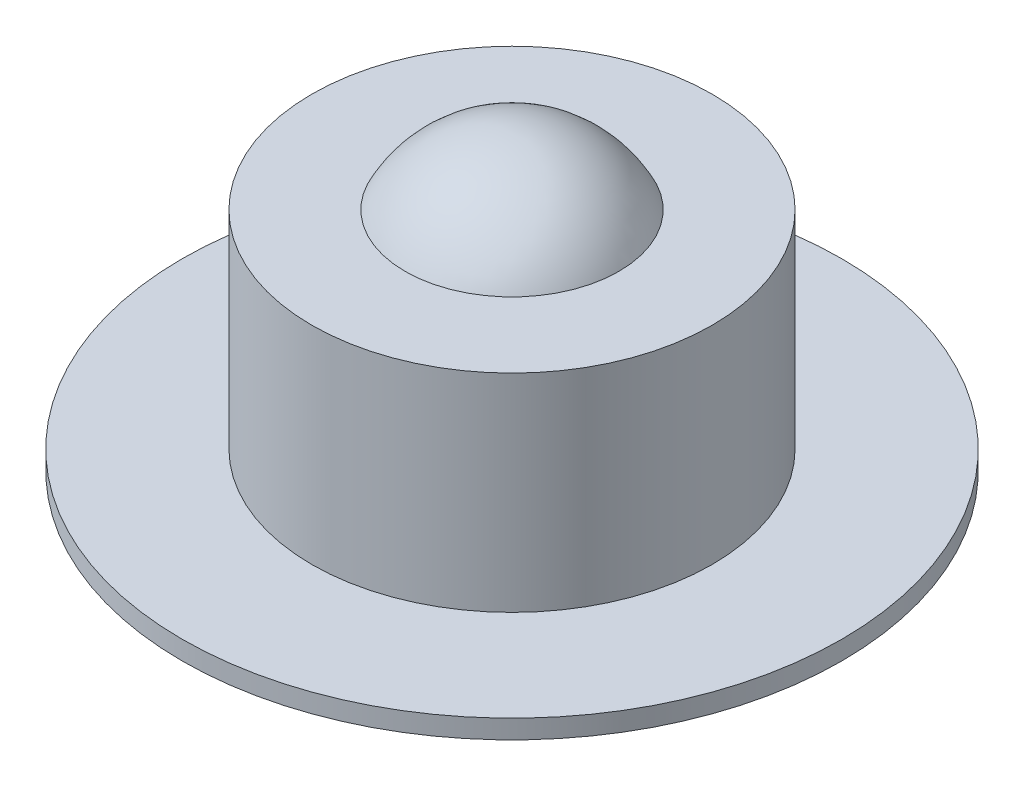
ISO-10303-21;
HEADER;
FILE_DESCRIPTION(('STEP AP214'),'2;1');
FILE_NAME('part.step','',(''),(''),'','','');
FILE_SCHEMA(('AUTOMOTIVE_DESIGN { 1 0 10303 214 1 1 1 1 }'));
ENDSEC;
DATA;
#1=APPLICATION_CONTEXT('core data for automotive mechanical design processes');
#2=APPLICATION_PROTOCOL_DEFINITION('international standard','automotive_design',2000,#1);
#3=PRODUCT_CONTEXT('',#1,'mechanical');
#4=PRODUCT('Part','Part','',(#3));
#5=PRODUCT_RELATED_PRODUCT_CATEGORY('part','',(#4));
#6=PRODUCT_DEFINITION_FORMATION('','',#4);
#7=PRODUCT_DEFINITION_CONTEXT('part definition',#1,'design');
#8=PRODUCT_DEFINITION('design','',#6,#7);
#9=PRODUCT_DEFINITION_SHAPE('','',#8);
#10=(LENGTH_UNIT() NAMED_UNIT(*) SI_UNIT(.MILLI.,.METRE.));
#11=(NAMED_UNIT(*) PLANE_ANGLE_UNIT() SI_UNIT($,.RADIAN.));
#12=(NAMED_UNIT(*) SI_UNIT($,.STERADIAN.) SOLID_ANGLE_UNIT());
#13=UNCERTAINTY_MEASURE_WITH_UNIT(LENGTH_MEASURE(1.E-05),#10,'distance_accuracy_value','');
#14=(GEOMETRIC_REPRESENTATION_CONTEXT(3) GLOBAL_UNCERTAINTY_ASSIGNED_CONTEXT((#13)) GLOBAL_UNIT_ASSIGNED_CONTEXT((#10,
#11,#12)) REPRESENTATION_CONTEXT('',''));
#15=CARTESIAN_POINT('',(0.,0.,0.));
#16=DIRECTION('',(0.,0.,1.));
#17=DIRECTION('',(1.,0.,0.));
#18=AXIS2_PLACEMENT_3D('',#15,#16,#17);
#19=CARTESIAN_POINT('',(0.,2.,0.));
#20=DIRECTION('',(0.,-1.,0.));
#21=DIRECTION('',(0.,0.,-1.));
#22=AXIS2_PLACEMENT_3D('',#19,#20,#21);
#23=CYLINDRICAL_SURFACE('',#22,35.);
#24=CARTESIAN_POINT('',(0.,2.,0.));
#25=DIRECTION('',(0.,1.,0.));
#26=DIRECTION('',(0.,0.,1.));
#27=AXIS2_PLACEMENT_3D('',#24,#25,#26);
#28=CIRCLE('',#27,35.);
#29=CARTESIAN_POINT('',(0.,2.,35.));
#30=VERTEX_POINT('',#29);
#31=EDGE_CURVE('E10',#30,#30,#28,.T.);
#32=ORIENTED_EDGE('',*,*,#31,.F.);
#33=EDGE_LOOP('',(#32));
#34=FACE_BOUND('',#33,.T.);
#35=CARTESIAN_POINT('',(0.,0.,0.));
#36=DIRECTION('',(0.,1.,0.));
#37=DIRECTION('',(0.,0.,1.));
#38=AXIS2_PLACEMENT_3D('',#35,#36,#37);
#39=CIRCLE('',#38,35.);
#40=CARTESIAN_POINT('',(0.,0.,35.));
#41=VERTEX_POINT('',#40);
#42=EDGE_CURVE('E47',#41,#41,#39,.T.);
#43=ORIENTED_EDGE('',*,*,#42,.T.);
#44=EDGE_LOOP('',(#43));
#45=FACE_BOUND('',#44,.T.);
#46=ADVANCED_FACE('F39',(#34,#45),#23,.T.);
#47=CARTESIAN_POINT('',(0.,2.,0.));
#48=DIRECTION('',(0.,1.,0.));
#49=DIRECTION('',(0.,0.,1.));
#50=AXIS2_PLACEMENT_3D('',#47,#48,#49);
#51=PLANE('',#50);
#52=CARTESIAN_POINT('',(0.,2.,0.));
#53=DIRECTION('',(0.,1.,0.));
#54=DIRECTION('',(0.,0.,1.));
#55=AXIS2_PLACEMENT_3D('',#52,#53,#54);
#56=CIRCLE('',#55,21.25);
#57=CARTESIAN_POINT('',(0.,2.,21.25));
#58=VERTEX_POINT('',#57);
#59=EDGE_CURVE('E53',#58,#58,#56,.F.);
#60=ORIENTED_EDGE('',*,*,#59,.T.);
#61=EDGE_LOOP('',(#60));
#62=FACE_BOUND('',#61,.T.);
#63=ORIENTED_EDGE('',*,*,#31,.T.);
#64=EDGE_LOOP('',(#63));
#65=FACE_BOUND('',#64,.T.);
#66=ADVANCED_FACE('F78',(#62,#65),#51,.T.);
#67=CARTESIAN_POINT('',(0.,0.,0.));
#68=DIRECTION('',(0.,1.,0.));
#69=DIRECTION('',(0.,0.,1.));
#70=AXIS2_PLACEMENT_3D('',#67,#68,#69);
#71=PLANE('',#70);
#72=ORIENTED_EDGE('',*,*,#42,.F.);
#73=EDGE_LOOP('',(#72));
#74=FACE_BOUND('',#73,.T.);
#75=ADVANCED_FACE('F83',(#74),#71,.F.);
#76=CARTESIAN_POINT('',(0.,24.,0.));
#77=DIRECTION('',(0.,-1.,0.));
#78=DIRECTION('',(0.,0.,-1.));
#79=AXIS2_PLACEMENT_3D('',#76,#77,#78);
#80=CYLINDRICAL_SURFACE('',#79,21.25);
#81=ORIENTED_EDGE('',*,*,#59,.F.);
#82=EDGE_LOOP('',(#81));
#83=FACE_BOUND('',#82,.T.);
#84=CARTESIAN_POINT('',(0.,24.,0.));
#85=DIRECTION('',(0.,1.,0.));
#86=DIRECTION('',(0.,0.,1.));
#87=AXIS2_PLACEMENT_3D('',#84,#85,#86);
#88=CIRCLE('',#87,21.25);
#89=CARTESIAN_POINT('',(0.,24.,21.25));
#90=VERTEX_POINT('',#89);
#91=EDGE_CURVE('E58',#90,#90,#88,.T.);
#92=ORIENTED_EDGE('',*,*,#91,.F.);
#93=EDGE_LOOP('',(#92));
#94=FACE_BOUND('',#93,.T.);
#95=ADVANCED_FACE('F75',(#83,#94),#80,.T.);
#96=CARTESIAN_POINT('',(0.,24.,0.));
#97=DIRECTION('',(0.,1.,0.));
#98=DIRECTION('',(0.,0.,1.));
#99=AXIS2_PLACEMENT_3D('',#96,#97,#98);
#100=PLANE('',#99);
#101=CARTESIAN_POINT('',(0.,24.,0.));
#102=DIRECTION('',(0.,1.,0.));
#103=DIRECTION('',(0.,0.,1.));
#104=AXIS2_PLACEMENT_3D('',#101,#102,#103);
#105=CIRCLE('',#104,11.3490087672889);
#106=CARTESIAN_POINT('',(0.,24.,11.3490087672889));
#107=VERTEX_POINT('',#106);
#108=EDGE_CURVE('E42',#107,#107,#105,.F.);
#109=ORIENTED_EDGE('',*,*,#108,.T.);
#110=EDGE_LOOP('',(#109));
#111=FACE_BOUND('',#110,.T.);
#112=ORIENTED_EDGE('',*,*,#91,.T.);
#113=EDGE_LOOP('',(#112));
#114=FACE_BOUND('',#113,.T.);
#115=ADVANCED_FACE('F67',(#111,#114),#100,.T.);
#116=CARTESIAN_POINT('',(0.,18.3,0.));
#117=DIRECTION('',(-1.,0.,0.));
#118=DIRECTION('',(0.,1.,0.));
#119=AXIS2_PLACEMENT_3D('',#116,#117,#118);
#120=SPHERICAL_SURFACE('',#119,12.7);
#121=CARTESIAN_POINT('',(0.,18.3,0.));
#122=DIRECTION('',(0.,1.,0.));
#123=DIRECTION('',(0.,0.,1.));
#124=AXIS2_PLACEMENT_3D('',#121,#122,#123);
#125=SPHERICAL_SURFACE('',#124,12.7);
#126=ORIENTED_EDGE('',*,*,#108,.F.);
#127=EDGE_LOOP('',(#126));
#128=FACE_BOUND('',#127,.T.);
#129=ADVANCED_FACE('F69',(#128),#125,.T.);
#130=CLOSED_SHELL('',(#46,#66,#75,#95,#115,#129));
#131=MANIFOLD_SOLID_BREP('B2',#130);
#132=ADVANCED_BREP_SHAPE_REPRESENTATION('',(#18,#131),#14);
#133=SHAPE_DEFINITION_REPRESENTATION(#9,#132);
ENDSEC;
END-ISO-10303-21;
